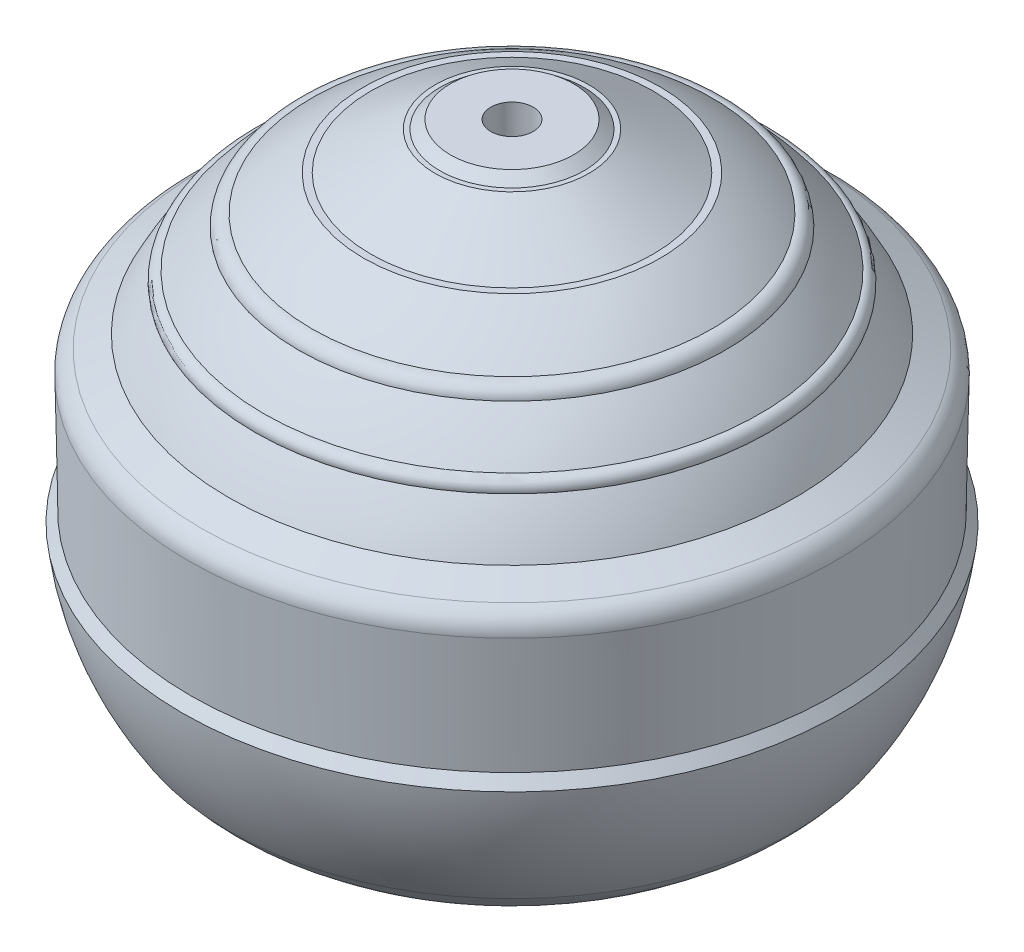
ISO-10303-21;
HEADER;
FILE_DESCRIPTION(('STEP AP214'),'2;1');
FILE_NAME('part.step','',(''),(''),'','','');
FILE_SCHEMA(('AUTOMOTIVE_DESIGN { 1 0 10303 214 1 1 1 1 }'));
ENDSEC;
DATA;
#1=APPLICATION_CONTEXT('core data for automotive mechanical design processes');
#2=APPLICATION_PROTOCOL_DEFINITION('international standard','automotive_design',2000,#1);
#3=PRODUCT_CONTEXT('',#1,'mechanical');
#4=PRODUCT('Part','Part','',(#3));
#5=PRODUCT_RELATED_PRODUCT_CATEGORY('part','',(#4));
#6=PRODUCT_DEFINITION_FORMATION('','',#4);
#7=PRODUCT_DEFINITION_CONTEXT('part definition',#1,'design');
#8=PRODUCT_DEFINITION('design','',#6,#7);
#9=PRODUCT_DEFINITION_SHAPE('','',#8);
#10=(LENGTH_UNIT() NAMED_UNIT(*) SI_UNIT(.MILLI.,.METRE.));
#11=(NAMED_UNIT(*) PLANE_ANGLE_UNIT() SI_UNIT($,.RADIAN.));
#12=(NAMED_UNIT(*) SI_UNIT($,.STERADIAN.) SOLID_ANGLE_UNIT());
#13=UNCERTAINTY_MEASURE_WITH_UNIT(LENGTH_MEASURE(1.E-05),#10,'distance_accuracy_value','');
#14=(GEOMETRIC_REPRESENTATION_CONTEXT(3) GLOBAL_UNCERTAINTY_ASSIGNED_CONTEXT((#13)) GLOBAL_UNIT_ASSIGNED_CONTEXT((#10,
#11,#12)) REPRESENTATION_CONTEXT('',''));
#15=CARTESIAN_POINT('',(0.,0.,0.));
#16=DIRECTION('',(0.,0.,1.));
#17=DIRECTION('',(1.,0.,0.));
#18=AXIS2_PLACEMENT_3D('',#15,#16,#17);
#19=CARTESIAN_POINT('',(0.,-14.,0.));
#20=DIRECTION('',(0.,1.,0.));
#21=DIRECTION('',(1.,0.,0.));
#22=AXIS2_PLACEMENT_3D('',#19,#20,#21);
#23=SPHERICAL_SURFACE('',#22,12.);
#24=CARTESIAN_POINT('',(0.,-21.637727134901,0.));
#25=DIRECTION('',(0.,1.,0.));
#26=DIRECTION('',(0.,0.,1.));
#27=AXIS2_PLACEMENT_3D('',#24,#25,#26);
#28=CIRCLE('',#27,9.25554559238932);
#29=CARTESIAN_POINT('',(9.25554559238932,-21.637727134901,0.));
#30=VERTEX_POINT('',#29);
#31=EDGE_CURVE('E10',#30,#30,#28,.T.);
#32=CARTESIAN_POINT('',(0.,-2.03379759489251,0.));
#33=DIRECTION('',(0.,-1.,0.));
#34=DIRECTION('',(0.,0.,-1.));
#35=AXIS2_PLACEMENT_3D('',#32,#33,#34);
#36=CIRCLE('',#35,0.9);
#37=CARTESIAN_POINT('',(0.899999999999977,-2.03379759489251,0.));
#38=VERTEX_POINT('',#37);
#39=EDGE_CURVE('E88',#38,#38,#36,.F.);
#40=CARTESIAN_POINT('',(9.25554559238932,-21.637727134901,0.));
#41=CARTESIAN_POINT('',(9.42944769647896,-21.427013700138,0.));
#42=CARTESIAN_POINT('',(9.59612865929379,-21.2103437355002,0.));
#43=CARTESIAN_POINT('',(9.91432679162781,-20.7661410907214,0.));
#44=CARTESIAN_POINT('',(10.065843961147,-20.5386084105802,0.));
#45=CARTESIAN_POINT('',(10.3529929961436,-20.0737306790407,0.));
#46=CARTESIAN_POINT('',(10.4886248616211,-19.8363856276424,0.));
#47=CARTESIAN_POINT('',(10.7433748029479,-19.3529928289003,0.));
#48=CARTESIAN_POINT('',(10.8624928787972,-19.1069450815567,0.));
#49=CARTESIAN_POINT('',(11.0836586867744,-18.6072935124329,0.));
#50=CARTESIAN_POINT('',(11.1857064189022,-18.3536896906527,0.));
#51=CARTESIAN_POINT('',(11.3722559495426,-17.8401088047844,0.));
#52=CARTESIAN_POINT('',(11.4567577480552,-17.5801317406963,0.));
#53=CARTESIAN_POINT('',(11.6078212787017,-17.0550166614486,0.));
#54=CARTESIAN_POINT('',(11.6743830108355,-16.789878646289,0.));
#55=CARTESIAN_POINT('',(11.7892560332233,-16.2556780930727,0.));
#56=CARTESIAN_POINT('',(11.8375673234773,-15.9866155550161,0.));
#57=CARTESIAN_POINT('',(11.9157141673947,-15.4458206665904,0.));
#58=CARTESIAN_POINT('',(11.9455497210581,-15.1740883162215,0.));
#59=CARTESIAN_POINT('',(11.9866059616695,-14.6292209688676,0.));
#60=CARTESIAN_POINT('',(11.9978266486176,-14.3560859718826,0.));
#61=CARTESIAN_POINT('',(12.0016008301716,-13.8096870365842,0.));
#62=CARTESIAN_POINT('',(11.9941543247775,-13.5364230982707,0.));
#63=CARTESIAN_POINT('',(11.9606288469097,-12.991040587253,0.));
#64=CARTESIAN_POINT('',(11.9345498744359,-12.7189220145488,0.));
#65=CARTESIAN_POINT('',(11.8638810759886,-12.1770992004278,0.));
#66=CARTESIAN_POINT('',(11.819291250015,-11.907394959011,0.));
#67=CARTESIAN_POINT('',(11.7118086795178,-11.3716585144606,0.));
#68=CARTESIAN_POINT('',(11.6489159349941,-11.1056263113271,0.));
#69=CARTESIAN_POINT('',(11.5051208140113,-10.5784745265815,0.));
#70=CARTESIAN_POINT('',(11.424218437552,-10.3173549449694,0.));
#71=CARTESIAN_POINT('',(11.2447813233113,-9.80124607756617,0.));
#72=CARTESIAN_POINT('',(11.1462465855298,-9.54625679177501,0.));
#73=CARTESIAN_POINT('',(10.9320042439339,-9.0435976030132,0.));
#74=CARTESIAN_POINT('',(10.8162966401195,-8.79592770004255,0.));
#75=CARTESIAN_POINT('',(10.5682481436681,-8.3090622315736,0.));
#76=CARTESIAN_POINT('',(10.435907251031,-8.0698666660753,0.));
#77=CARTESIAN_POINT('',(10.1552093198643,-7.60106530897651,0.));
#78=CARTESIAN_POINT('',(10.0068522813346,-7.37145951737602,0.));
#79=CARTESIAN_POINT('',(9.69481388912098,-6.9229084246732,0.));
#80=CARTESIAN_POINT('',(9.53113253543711,-6.70396312357086,0.));
#81=CARTESIAN_POINT('',(9.18920880525832,-6.27775401560079,0.));
#82=CARTESIAN_POINT('',(9.01096642876338,-6.07049020873305,0.));
#83=CARTESIAN_POINT('',(8.64075184747047,-5.6686106188204,0.));
#84=CARTESIAN_POINT('',(8.4487796426725,-5.47399483577549,0.));
#85=CARTESIAN_POINT('',(8.05200062532188,-5.09831884195647,0.));
#86=CARTESIAN_POINT('',(7.84719381276922,-4.91725863118237,0.));
#87=CARTESIAN_POINT('',(7.42570065194408,-4.56953811628104,0.));
#88=CARTESIAN_POINT('',(7.20901430367159,-4.40287781215381,0.));
#89=CARTESIAN_POINT('',(6.76477254073892,-4.08473429638142,0.));
#90=CARTESIAN_POINT('',(6.53721712607875,-3.93325108473625,0.));
#91=CARTESIAN_POINT('',(6.07229838645927,-3.64616815616034,0.));
#92=CARTESIAN_POINT('',(5.83493506149996,-3.51056843922959,0.));
#93=CARTESIAN_POINT('',(5.35150738982464,-3.25588486495899,0.));
#94=CARTESIAN_POINT('',(5.10544304310861,-3.13680100761915,0.));
#95=CARTESIAN_POINT('',(4.60576080894868,-2.9157043803804,0.));
#96=CARTESIAN_POINT('',(4.35214292150476,-2.81369161048149,0.));
#97=CARTESIAN_POINT('',(3.83853624714381,-2.62721322246299,0.));
#98=CARTESIAN_POINT('',(3.57854746022677,-2.54274760434338,0.));
#99=CARTESIAN_POINT('',(3.05341157657462,-2.39175610066678,0.));
#100=CARTESIAN_POINT('',(2.78826447983952,-2.32523021510978,0.));
#101=CARTESIAN_POINT('',(2.2540477285343,-2.21043328045682,0.));
#102=CARTESIAN_POINT('',(1.98497807396418,-2.16216223136086,0.));
#103=CARTESIAN_POINT('',(1.44417358117364,-2.08408187770545,0.));
#104=CARTESIAN_POINT('',(1.17243874295322,-2.05427257314599,0.));
#105=CARTESIAN_POINT('',(0.899999999999977,-2.03379759489251,0.));
#106=B_SPLINE_CURVE_WITH_KNOTS('',3,(#40,#41,#42,#43,#44,#45,#46,#47,#48,#49,#50,#51,#52,#53,
#54,#55,#56,#57,#58,#59,#60,#61,#62,#63,#64,#65,#66,#67,#68,#69,#70,#71,#72,#73,#74,#75,#76,#77,
#78,#79,#80,#81,#82,#83,#84,#85,#86,#87,#88,#89,#90,#91,#92,#93,#94,#95,#96,#97,#98,#99,#100,
#101,#102,#103,#104,#105),.UNSPECIFIED.,.F.,.F.,(4,2,2,2,2,2,2,2,2,2,2,2,2,2,2,2,2,2,2,2,2,2,2,
2,2,2,2,2,2,2,2,2,4),(0.,0.819458746948075,1.63891749389615,2.45837624084423,3.2778349877923,
4.09729373474038,4.91675248168845,5.73621122863653,6.55566997558461,7.37512872253268,
8.19458746948076,9.01404621642883,9.83350496337691,10.652963710325,11.4724224572731,
12.2918812042211,13.1113399511692,13.9307986981173,14.7502574450654,15.5697161920134,
16.3891749389615,17.2086336859096,18.0280924328577,18.8475511798057,19.6670099267538,
20.4864686737019,21.30592742065,22.125386167598,22.9448449145461,23.7643036614942,
24.5837624084423,25.4032211553904,26.2226799023384),.UNSPECIFIED.);
#107=EDGE_CURVE('BSEAM30',#30,#38,#106,.T.);
#108=ORIENTED_EDGE('',*,*,#31,.F.);
#109=ORIENTED_EDGE('',*,*,#39,.T.);
#110=ORIENTED_EDGE('',*,*,#107,.T.);
#111=ORIENTED_EDGE('',*,*,#107,.F.);
#112=EDGE_LOOP('',(#108,#110,#109,#111));
#113=FACE_BOUND('',#112,.T.);
#114=ADVANCED_FACE('F30',(#113),#23,.F.);
#115=CARTESIAN_POINT('',(9.25554559238934,-21.637727134901,0.));
#116=DIRECTION('',(0.,1.,0.));
#117=DIRECTION('',(0.,0.,1.));
#118=AXIS2_PLACEMENT_3D('',#115,#116,#117);
#119=PLANE('',#118);
#120=CARTESIAN_POINT('',(0.,-21.637727134901,0.));
#121=DIRECTION('',(0.,1.,0.));
#122=DIRECTION('',(0.,0.,1.));
#123=AXIS2_PLACEMENT_3D('',#120,#121,#122);
#124=CIRCLE('',#123,10.2575018895566);
#125=CARTESIAN_POINT('',(0.,-21.637727134901,10.2575018895566));
#126=VERTEX_POINT('',#125);
#127=EDGE_CURVE('E36',#126,#126,#124,.T.);
#128=ORIENTED_EDGE('',*,*,#127,.F.);
#129=EDGE_LOOP('',(#128));
#130=FACE_BOUND('',#129,.T.);
#131=ORIENTED_EDGE('',*,*,#31,.T.);
#132=EDGE_LOOP('',(#131));
#133=FACE_BOUND('',#132,.T.);
#134=ADVANCED_FACE('F190',(#130,#133),#119,.F.);
#135=CARTESIAN_POINT('',(0.,-16.2688611046862,0.));
#136=DIRECTION('',(0.,1.,0.));
#137=DIRECTION('',(0.,0.,1.));
#138=AXIS2_PLACEMENT_3D('',#135,#136,#137);
#139=TOROIDAL_SURFACE('',#138,7.30537589321545,6.12697073182722);
#140=CARTESIAN_POINT('',(0.,-20.1628484349161,0.));
#141=DIRECTION('',(0.,1.,0.));
#142=DIRECTION('',(0.,0.,1.));
#143=AXIS2_PLACEMENT_3D('',#140,#141,#142);
#144=CIRCLE('',#143,12.0357704878213);
#145=CARTESIAN_POINT('',(0.,-20.1628484349161,12.0357704878213));
#146=VERTEX_POINT('',#145);
#147=EDGE_CURVE('E40',#146,#146,#144,.T.);
#148=ORIENTED_EDGE('',*,*,#147,.F.);
#149=EDGE_LOOP('',(#148));
#150=FACE_BOUND('',#149,.T.);
#151=ORIENTED_EDGE('',*,*,#127,.T.);
#152=EDGE_LOOP('',(#151));
#153=FACE_BOUND('',#152,.T.);
#154=ADVANCED_FACE('F185',(#150,#153),#139,.T.);
#155=CARTESIAN_POINT('',(0.,-13.4634424219215,0.));
#156=DIRECTION('',(0.,1.,0.));
#157=DIRECTION('',(0.,0.,1.));
#158=AXIS2_PLACEMENT_3D('',#155,#156,#157);
#159=DEGENERATE_TOROIDAL_SURFACE('',#158,2.07997021496259,12.,.T.);
#160=CARTESIAN_POINT('',(0.,-14.8465150605864,0.));
#161=DIRECTION('',(0.,1.,0.));
#162=DIRECTION('',(0.,0.,1.));
#163=AXIS2_PLACEMENT_3D('',#160,#161,#162);
#164=CIRCLE('',#163,14.);
#165=CARTESIAN_POINT('',(0.,-14.8465150605864,14.));
#166=VERTEX_POINT('',#165);
#167=EDGE_CURVE('E44',#166,#166,#164,.T.);
#168=ORIENTED_EDGE('',*,*,#167,.F.);
#169=EDGE_LOOP('',(#168));
#170=FACE_BOUND('',#169,.T.);
#171=ORIENTED_EDGE('',*,*,#147,.T.);
#172=EDGE_LOOP('',(#171));
#173=FACE_BOUND('',#172,.T.);
#174=ADVANCED_FACE('F179',(#170,#173),#159,.T.);
#175=CARTESIAN_POINT('',(0.,-14.8465150605864,0.));
#176=DIRECTION('',(0.,-1.,0.));
#177=DIRECTION('',(0.,0.,-1.));
#178=AXIS2_PLACEMENT_3D('',#175,#176,#177);
#179=CONICAL_SURFACE('',#178,14.,0.64538258116156);
#180=CARTESIAN_POINT('',(0.,-14.3816730279882,0.));
#181=DIRECTION('',(0.,1.,0.));
#182=DIRECTION('',(0.,0.,1.));
#183=AXIS2_PLACEMENT_3D('',#180,#181,#182);
#184=CIRCLE('',#183,13.6499999999999);
#185=CARTESIAN_POINT('',(0.,-14.3816730279882,13.6499999999999));
#186=VERTEX_POINT('',#185);
#187=EDGE_CURVE('E49',#186,#186,#184,.T.);
#188=ORIENTED_EDGE('',*,*,#187,.F.);
#189=EDGE_LOOP('',(#188));
#190=FACE_BOUND('',#189,.T.);
#191=ORIENTED_EDGE('',*,*,#167,.T.);
#192=EDGE_LOOP('',(#191));
#193=FACE_BOUND('',#192,.T.);
#194=ADVANCED_FACE('F173',(#190,#193),#179,.T.);
#195=CARTESIAN_POINT('',(0.,-14.3816730279882,0.));
#196=DIRECTION('',(0.,1.,0.));
#197=DIRECTION('',(0.,0.,1.));
#198=AXIS2_PLACEMENT_3D('',#195,#196,#197);
#199=CONICAL_SURFACE('',#198,13.6499999999999,0.0177438690323497);
#200=CARTESIAN_POINT('',(0.,-9.3800346648362,0.));
#201=DIRECTION('',(0.,1.,0.));
#202=DIRECTION('',(0.,0.,1.));
#203=AXIS2_PLACEMENT_3D('',#200,#201,#202);
#204=CIRCLE('',#203,13.7387577312311);
#205=CARTESIAN_POINT('',(0.,-9.3800346648362,13.7387577312311));
#206=VERTEX_POINT('',#205);
#207=EDGE_CURVE('E52',#206,#206,#204,.T.);
#208=ORIENTED_EDGE('',*,*,#207,.F.);
#209=EDGE_LOOP('',(#208));
#210=FACE_BOUND('',#209,.T.);
#211=ORIENTED_EDGE('',*,*,#187,.T.);
#212=EDGE_LOOP('',(#211));
#213=FACE_BOUND('',#212,.T.);
#214=ADVANCED_FACE('F167',(#210,#213),#199,.T.);
#215=CARTESIAN_POINT('',(0.,-9.36229172688359,0.));
#216=DIRECTION('',(0.,1.,0.));
#217=DIRECTION('',(0.,0.,1.));
#218=AXIS2_PLACEMENT_3D('',#215,#216,#217);
#219=TOROIDAL_SURFACE('',#218,12.7389151495449,1.00000000000004);
#220=CARTESIAN_POINT('',(0.,-8.46579271377194,0.));
#221=DIRECTION('',(0.,1.,0.));
#222=DIRECTION('',(0.,0.,1.));
#223=AXIS2_PLACEMENT_3D('',#220,#221,#222);
#224=CIRCLE('',#223,13.1819608802431);
#225=CARTESIAN_POINT('',(0.,-8.46579271377194,13.1819608802431));
#226=VERTEX_POINT('',#225);
#227=EDGE_CURVE('E55',#226,#226,#224,.T.);
#228=ORIENTED_EDGE('',*,*,#227,.F.);
#229=EDGE_LOOP('',(#228));
#230=FACE_BOUND('',#229,.T.);
#231=ORIENTED_EDGE('',*,*,#207,.T.);
#232=EDGE_LOOP('',(#231));
#233=FACE_BOUND('',#232,.T.);
#234=ADVANCED_FACE('F161',(#230,#233),#219,.T.);
#235=CARTESIAN_POINT('',(0.,-8.46579271377194,0.));
#236=DIRECTION('',(0.,-1.,0.));
#237=DIRECTION('',(0.,0.,-1.));
#238=AXIS2_PLACEMENT_3D('',#235,#236,#237);
#239=CONICAL_SURFACE('',#238,13.1819608802431,1.11180313322225);
#240=CARTESIAN_POINT('',(0.,-7.89935064021385,0.));
#241=DIRECTION('',(0.,1.,0.));
#242=DIRECTION('',(0.,0.,1.));
#243=AXIS2_PLACEMENT_3D('',#240,#241,#242);
#244=CIRCLE('',#243,12.0357704878213);
#245=CARTESIAN_POINT('',(0.,-7.89935064021385,12.0357704878213));
#246=VERTEX_POINT('',#245);
#247=EDGE_CURVE('E58',#246,#246,#244,.T.);
#248=ORIENTED_EDGE('',*,*,#247,.F.);
#249=EDGE_LOOP('',(#248));
#250=FACE_BOUND('',#249,.T.);
#251=ORIENTED_EDGE('',*,*,#227,.T.);
#252=EDGE_LOOP('',(#251));
#253=FACE_BOUND('',#252,.T.);
#254=ADVANCED_FACE('F155',(#250,#253),#239,.T.);
#255=CARTESIAN_POINT('',(0.,-14.2208265635886,0.));
#256=DIRECTION('',(0.,1.,0.));
#257=DIRECTION('',(0.,0.,1.));
#258=AXIS2_PLACEMENT_3D('',#255,#256,#257);
#259=DEGENERATE_TOROIDAL_SURFACE('',#258,0.455784345352706,14.,.F.);
#260=CARTESIAN_POINT('',(0.,-6.05983622658932,0.));
#261=DIRECTION('',(0.,1.,0.));
#262=DIRECTION('',(0.,0.,1.));
#263=AXIS2_PLACEMENT_3D('',#260,#261,#262);
#264=CIRCLE('',#263,10.9195502307995);
#265=CARTESIAN_POINT('',(0.,-6.05983622658932,10.9195502307995));
#266=VERTEX_POINT('',#265);
#267=EDGE_CURVE('E61',#266,#266,#264,.T.);
#268=ORIENTED_EDGE('',*,*,#267,.F.);
#269=EDGE_LOOP('',(#268));
#270=FACE_BOUND('',#269,.T.);
#271=ORIENTED_EDGE('',*,*,#247,.T.);
#272=EDGE_LOOP('',(#271));
#273=FACE_BOUND('',#272,.T.);
#274=ADVANCED_FACE('F149',(#270,#273),#259,.F.);
#275=CARTESIAN_POINT('',(0.,-5.96377320523149,0.));
#276=DIRECTION('',(0.,1.,0.));
#277=DIRECTION('',(0.,0.,1.));
#278=AXIS2_PLACEMENT_3D('',#275,#276,#277);
#279=TOROIDAL_SURFACE('',#278,10.5268429840381,0.404285896033104);
#280=CARTESIAN_POINT('',(0.,-5.55983622658919,0.));
#281=DIRECTION('',(0.,1.,0.));
#282=DIRECTION('',(0.,0.,1.));
#283=AXIS2_PLACEMENT_3D('',#280,#281,#282);
#284=CIRCLE('',#283,10.5436359294801);
#285=CARTESIAN_POINT('',(0.,-5.55983622658919,10.5436359294801));
#286=VERTEX_POINT('',#285);
#287=EDGE_CURVE('E64',#286,#286,#284,.T.);
#288=ORIENTED_EDGE('',*,*,#287,.F.);
#289=EDGE_LOOP('',(#288));
#290=FACE_BOUND('',#289,.T.);
#291=ORIENTED_EDGE('',*,*,#267,.T.);
#292=EDGE_LOOP('',(#291));
#293=FACE_BOUND('',#292,.T.);
#294=ADVANCED_FACE('F143',(#290,#293),#279,.T.);
#295=CARTESIAN_POINT('',(0.,-14.2208265635886,0.));
#296=DIRECTION('',(0.,1.,0.));
#297=DIRECTION('',(0.,0.,1.));
#298=AXIS2_PLACEMENT_3D('',#295,#296,#297);
#299=DEGENERATE_TOROIDAL_SURFACE('',#298,0.455784345352706,14.,.F.);
#300=CARTESIAN_POINT('',(0.,-3.95983622658918,0.));
#301=DIRECTION('',(0.,1.,0.));
#302=DIRECTION('',(0.,0.,1.));
#303=AXIS2_PLACEMENT_3D('',#300,#301,#302);
#304=CIRCLE('',#303,9.06850446295232);
#305=CARTESIAN_POINT('',(0.,-3.95983622658918,9.06850446295232));
#306=VERTEX_POINT('',#305);
#307=EDGE_CURVE('E67',#306,#306,#304,.T.);
#308=ORIENTED_EDGE('',*,*,#307,.F.);
#309=EDGE_LOOP('',(#308));
#310=FACE_BOUND('',#309,.T.);
#311=ORIENTED_EDGE('',*,*,#287,.T.);
#312=EDGE_LOOP('',(#311));
#313=FACE_BOUND('',#312,.T.);
#314=ADVANCED_FACE('F137',(#310,#313),#299,.F.);
#315=CARTESIAN_POINT('',(0.,-3.99743622218507,0.));
#316=DIRECTION('',(0.,1.,0.));
#317=DIRECTION('',(0.,0.,1.));
#318=AXIS2_PLACEMENT_3D('',#315,#316,#317);
#319=TOROIDAL_SURFACE('',#318,8.53129247945289,0.53852620631146);
#320=CARTESIAN_POINT('',(0.,-3.45983622658914,0.));
#321=DIRECTION('',(0.,1.,0.));
#322=DIRECTION('',(0.,0.,1.));
#323=AXIS2_PLACEMENT_3D('',#320,#321,#322);
#324=CIRCLE('',#323,8.49972161282764);
#325=CARTESIAN_POINT('',(0.,-3.45983622658914,8.49972161282764));
#326=VERTEX_POINT('',#325);
#327=EDGE_CURVE('E70',#326,#326,#324,.T.);
#328=ORIENTED_EDGE('',*,*,#327,.F.);
#329=EDGE_LOOP('',(#328));
#330=FACE_BOUND('',#329,.T.);
#331=ORIENTED_EDGE('',*,*,#307,.T.);
#332=EDGE_LOOP('',(#331));
#333=FACE_BOUND('',#332,.T.);
#334=ADVANCED_FACE('F131',(#330,#333),#319,.T.);
#335=CARTESIAN_POINT('',(0.,-14.2208265635886,0.));
#336=DIRECTION('',(0.,1.,0.));
#337=DIRECTION('',(0.,0.,1.));
#338=AXIS2_PLACEMENT_3D('',#335,#336,#337);
#339=DEGENERATE_TOROIDAL_SURFACE('',#338,0.455784345352706,14.,.F.);
#340=CARTESIAN_POINT('',(0.,-1.95983622658918,0.));
#341=DIRECTION('',(0.,1.,0.));
#342=DIRECTION('',(0.,0.,1.));
#343=AXIS2_PLACEMENT_3D('',#340,#341,#342);
#344=CIRCLE('',#343,6.30203453029099);
#345=CARTESIAN_POINT('',(0.,-1.95983622658918,6.30203453029099));
#346=VERTEX_POINT('',#345);
#347=EDGE_CURVE('E73',#346,#346,#344,.T.);
#348=ORIENTED_EDGE('',*,*,#347,.F.);
#349=EDGE_LOOP('',(#348));
#350=FACE_BOUND('',#349,.T.);
#351=ORIENTED_EDGE('',*,*,#327,.T.);
#352=EDGE_LOOP('',(#351));
#353=FACE_BOUND('',#352,.T.);
#354=ADVANCED_FACE('F125',(#350,#353),#339,.F.);
#355=CARTESIAN_POINT('',(6.30203453029099,-1.95983622658918,0.));
#356=DIRECTION('',(0.,-1.,0.));
#357=DIRECTION('',(0.,0.,-1.));
#358=AXIS2_PLACEMENT_3D('',#355,#356,#357);
#359=PLANE('',#358);
#360=CARTESIAN_POINT('',(0.,-1.95983622658918,0.));
#361=DIRECTION('',(0.,1.,0.));
#362=DIRECTION('',(0.,0.,1.));
#363=AXIS2_PLACEMENT_3D('',#360,#361,#362);
#364=CIRCLE('',#363,6.00203453029102);
#365=CARTESIAN_POINT('',(0.,-1.95983622658918,6.00203453029102));
#366=VERTEX_POINT('',#365);
#367=EDGE_CURVE('E76',#366,#366,#364,.T.);
#368=ORIENTED_EDGE('',*,*,#367,.F.);
#369=EDGE_LOOP('',(#368));
#370=FACE_BOUND('',#369,.T.);
#371=ORIENTED_EDGE('',*,*,#347,.T.);
#372=EDGE_LOOP('',(#371));
#373=FACE_BOUND('',#372,.T.);
#374=ADVANCED_FACE('F119',(#370,#373),#359,.F.);
#375=CARTESIAN_POINT('',(0.,-1.95983622658918,0.));
#376=DIRECTION('',(0.,-1.,0.));
#377=DIRECTION('',(0.,0.,-1.));
#378=AXIS2_PLACEMENT_3D('',#375,#376,#377);
#379=CONICAL_SURFACE('',#378,6.00203453029102,1.04160599140731);
#380=CARTESIAN_POINT('',(0.,-0.359836226589194,0.));
#381=DIRECTION('',(0.,1.,0.));
#382=DIRECTION('',(0.,0.,1.));
#383=AXIS2_PLACEMENT_3D('',#380,#381,#382);
#384=CIRCLE('',#383,3.26619632864616);
#385=CARTESIAN_POINT('',(0.,-0.359836226589194,3.26619632864616));
#386=VERTEX_POINT('',#385);
#387=EDGE_CURVE('E79',#386,#386,#384,.T.);
#388=ORIENTED_EDGE('',*,*,#387,.F.);
#389=EDGE_LOOP('',(#388));
#390=FACE_BOUND('',#389,.T.);
#391=ORIENTED_EDGE('',*,*,#367,.T.);
#392=EDGE_LOOP('',(#391));
#393=FACE_BOUND('',#392,.T.);
#394=ADVANCED_FACE('F113',(#390,#393),#379,.T.);
#395=CARTESIAN_POINT('',(3.26619632864616,-0.35983622658918,0.));
#396=DIRECTION('',(0.,-1.,0.));
#397=DIRECTION('',(0.,0.,-1.));
#398=AXIS2_PLACEMENT_3D('',#395,#396,#397);
#399=PLANE('',#398);
#400=CARTESIAN_POINT('',(0.,-0.359836226589166,0.));
#401=DIRECTION('',(0.,1.,0.));
#402=DIRECTION('',(0.,0.,1.));
#403=AXIS2_PLACEMENT_3D('',#400,#401,#402);
#404=CIRCLE('',#403,3.06619632864613);
#405=CARTESIAN_POINT('',(0.,-0.359836226589166,3.06619632864613));
#406=VERTEX_POINT('',#405);
#407=EDGE_CURVE('E82',#406,#406,#404,.T.);
#408=ORIENTED_EDGE('',*,*,#407,.F.);
#409=EDGE_LOOP('',(#408));
#410=FACE_BOUND('',#409,.T.);
#411=ORIENTED_EDGE('',*,*,#387,.T.);
#412=EDGE_LOOP('',(#411));
#413=FACE_BOUND('',#412,.T.);
#414=ADVANCED_FACE('F107',(#410,#413),#399,.F.);
#415=CARTESIAN_POINT('',(0.,-0.359836226589166,0.));
#416=DIRECTION('',(0.,-1.,0.));
#417=DIRECTION('',(0.,0.,-1.));
#418=AXIS2_PLACEMENT_3D('',#415,#416,#417);
#419=CONICAL_SURFACE('',#418,3.06619632864613,0.896055384571351);
#420=CARTESIAN_POINT('',(0.,0.,0.));
#421=DIRECTION('',(0.,1.,0.));
#422=DIRECTION('',(0.,0.,1.));
#423=AXIS2_PLACEMENT_3D('',#420,#421,#422);
#424=CIRCLE('',#423,2.61640104540967);
#425=CARTESIAN_POINT('',(0.,0.,2.61640104540967));
#426=VERTEX_POINT('',#425);
#427=EDGE_CURVE('E85',#426,#426,#424,.T.);
#428=ORIENTED_EDGE('',*,*,#427,.F.);
#429=EDGE_LOOP('',(#428));
#430=FACE_BOUND('',#429,.T.);
#431=ORIENTED_EDGE('',*,*,#407,.T.);
#432=EDGE_LOOP('',(#431));
#433=FACE_BOUND('',#432,.T.);
#434=ADVANCED_FACE('F101',(#430,#433),#419,.T.);
#435=CARTESIAN_POINT('',(2.61640104540967,0.,0.));
#436=DIRECTION('',(0.,-1.,0.));
#437=DIRECTION('',(0.,0.,-1.));
#438=AXIS2_PLACEMENT_3D('',#435,#436,#437);
#439=PLANE('',#438);
#440=CARTESIAN_POINT('',(0.,0.,0.));
#441=DIRECTION('',(0.,1.,0.));
#442=DIRECTION('',(0.,0.,1.));
#443=AXIS2_PLACEMENT_3D('',#440,#441,#442);
#444=CIRCLE('',#443,0.9);
#445=CARTESIAN_POINT('',(0.,0.,0.9));
#446=VERTEX_POINT('',#445);
#447=EDGE_CURVE('E91',#446,#446,#444,.T.);
#448=ORIENTED_EDGE('',*,*,#447,.F.);
#449=EDGE_LOOP('',(#448));
#450=FACE_BOUND('',#449,.T.);
#451=ORIENTED_EDGE('',*,*,#427,.T.);
#452=EDGE_LOOP('',(#451));
#453=FACE_BOUND('',#452,.T.);
#454=ADVANCED_FACE('F98',(#450,#453),#439,.F.);
#455=CARTESIAN_POINT('',(0.,-10.,0.));
#456=DIRECTION('',(0.,1.,0.));
#457=DIRECTION('',(0.,0.,1.));
#458=AXIS2_PLACEMENT_3D('',#455,#456,#457);
#459=CYLINDRICAL_SURFACE('',#458,0.9);
#460=ORIENTED_EDGE('',*,*,#447,.T.);
#461=EDGE_LOOP('',(#460));
#462=FACE_BOUND('',#461,.T.);
#463=ORIENTED_EDGE('',*,*,#39,.F.);
#464=EDGE_LOOP('',(#463));
#465=FACE_BOUND('',#464,.T.);
#466=ADVANCED_FACE('F95',(#462,#465),#459,.F.);
#467=CLOSED_SHELL('',(#114,#134,#154,#174,#194,#214,#234,#254,#274,#294,#314,#334,#354,#374,
#394,#414,#434,#454,#466));
#468=MANIFOLD_SOLID_BREP('B2',#467);
#469=ADVANCED_BREP_SHAPE_REPRESENTATION('',(#18,#468),#14);
#470=SHAPE_DEFINITION_REPRESENTATION(#9,#469);
ENDSEC;
END-ISO-10303-21;
